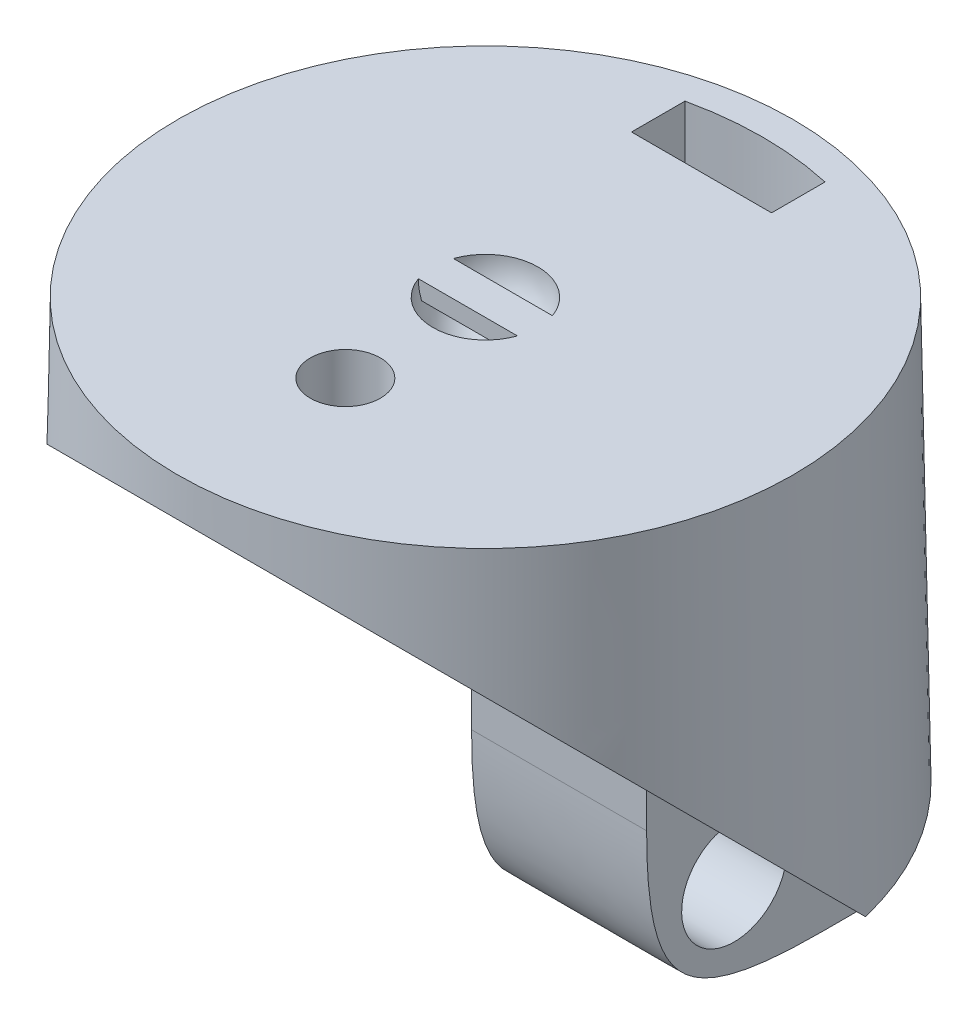
ISO-10303-21;
HEADER;
FILE_DESCRIPTION(('STEP AP214'),'2;1');
FILE_NAME('part.step','',(''),(''),'','','');
FILE_SCHEMA(('AUTOMOTIVE_DESIGN { 1 0 10303 214 1 1 1 1 }'));
ENDSEC;
DATA;
#1=APPLICATION_CONTEXT('core data for automotive mechanical design processes');
#2=APPLICATION_PROTOCOL_DEFINITION('international standard','automotive_design',2000,#1);
#3=PRODUCT_CONTEXT('',#1,'mechanical');
#4=PRODUCT('Part','Part','',(#3));
#5=PRODUCT_RELATED_PRODUCT_CATEGORY('part','',(#4));
#6=PRODUCT_DEFINITION_FORMATION('','',#4);
#7=PRODUCT_DEFINITION_CONTEXT('part definition',#1,'design');
#8=PRODUCT_DEFINITION('design','',#6,#7);
#9=PRODUCT_DEFINITION_SHAPE('','',#8);
#10=(LENGTH_UNIT() NAMED_UNIT(*) SI_UNIT(.MILLI.,.METRE.));
#11=(NAMED_UNIT(*) PLANE_ANGLE_UNIT() SI_UNIT($,.RADIAN.));
#12=(NAMED_UNIT(*) SI_UNIT($,.STERADIAN.) SOLID_ANGLE_UNIT());
#13=UNCERTAINTY_MEASURE_WITH_UNIT(LENGTH_MEASURE(1.E-05),#10,'distance_accuracy_value','');
#14=(GEOMETRIC_REPRESENTATION_CONTEXT(3) GLOBAL_UNCERTAINTY_ASSIGNED_CONTEXT((#13)) GLOBAL_UNIT_ASSIGNED_CONTEXT((#10,
#11,#12)) REPRESENTATION_CONTEXT('',''));
#15=CARTESIAN_POINT('',(0.,0.,0.));
#16=DIRECTION('',(0.,0.,1.));
#17=DIRECTION('',(1.,0.,0.));
#18=AXIS2_PLACEMENT_3D('',#15,#16,#17);
#19=CARTESIAN_POINT('',(0.,12.,0.));
#20=DIRECTION('',(-1.,0.,0.));
#21=DIRECTION('',(0.,0.,-1.));
#22=AXIS2_PLACEMENT_3D('',#19,#20,#21);
#23=SPHERICAL_SURFACE('',#22,1.5);
#24=CARTESIAN_POINT('',(0.,11.5,0.));
#25=DIRECTION('',(0.,1.,0.));
#26=DIRECTION('',(0.,0.,1.));
#27=AXIS2_PLACEMENT_3D('',#24,#25,#26);
#28=CIRCLE('',#27,1.4142135623731);
#29=CARTESIAN_POINT('',(1.3228756555323,11.5,0.500000000000002));
#30=VERTEX_POINT('',#29);
#31=CARTESIAN_POINT('',(1.3228756555323,11.5,-0.499999999999999));
#32=VERTEX_POINT('',#31);
#33=EDGE_CURVE('E72',#30,#32,#28,.T.);
#34=ORIENTED_EDGE('',*,*,#33,.T.);
#35=CARTESIAN_POINT('',(0.,12.,-0.499999999999998));
#36=DIRECTION('',(0.,0.,1.));
#37=DIRECTION('',(0.,-1.,0.));
#38=AXIS2_PLACEMENT_3D('',#35,#36,#37);
#39=CIRCLE('',#38,1.4142135623731);
#40=CARTESIAN_POINT('',(1.4142135623731,12.,-0.499999999999998));
#41=VERTEX_POINT('',#40);
#42=EDGE_CURVE('E14',#32,#41,#39,.T.);
#43=ORIENTED_EDGE('',*,*,#42,.T.);
#44=CARTESIAN_POINT('',(0.,12.,0.));
#45=DIRECTION('',(0.,-1.,0.));
#46=DIRECTION('',(0.,0.,-1.));
#47=AXIS2_PLACEMENT_3D('',#44,#45,#46);
#48=CIRCLE('',#47,1.5);
#49=CARTESIAN_POINT('',(-1.4142135623731,12.,-0.499999999999998));
#50=VERTEX_POINT('',#49);
#51=EDGE_CURVE('E168',#41,#50,#48,.F.);
#52=ORIENTED_EDGE('',*,*,#51,.T.);
#53=CARTESIAN_POINT('',(-1.3228756555323,11.5,-0.499999999999999));
#54=VERTEX_POINT('',#53);
#55=EDGE_CURVE('E61',#50,#54,#39,.T.);
#56=ORIENTED_EDGE('',*,*,#55,.T.);
#57=CARTESIAN_POINT('',(-1.3228756555323,11.5,0.500000000000002));
#58=VERTEX_POINT('',#57);
#59=EDGE_CURVE('E173',#54,#58,#28,.T.);
#60=ORIENTED_EDGE('',*,*,#59,.T.);
#61=CARTESIAN_POINT('',(0.,12.,0.500000000000002));
#62=DIRECTION('',(0.,0.,1.));
#63=DIRECTION('',(0.,-1.,0.));
#64=AXIS2_PLACEMENT_3D('',#61,#62,#63);
#65=CIRCLE('',#64,1.4142135623731);
#66=CARTESIAN_POINT('',(-1.4142135623731,12.,0.500000000000002));
#67=VERTEX_POINT('',#66);
#68=EDGE_CURVE('E171',#67,#58,#65,.T.);
#69=ORIENTED_EDGE('',*,*,#68,.F.);
#70=CARTESIAN_POINT('',(1.4142135623731,12.,0.500000000000002));
#71=VERTEX_POINT('',#70);
#72=EDGE_CURVE('E161',#67,#71,#48,.F.);
#73=ORIENTED_EDGE('',*,*,#72,.T.);
#74=EDGE_CURVE('E66',#30,#71,#65,.T.);
#75=ORIENTED_EDGE('',*,*,#74,.F.);
#76=EDGE_LOOP('',(#34,#43,#52,#56,#60,#69,#73,#75));
#77=FACE_BOUND('',#76,.T.);
#78=ADVANCED_FACE('F53',(#77),#23,.F.);
#79=CARTESIAN_POINT('',(0.,0.,0.));
#80=DIRECTION('',(0.,-1.,0.));
#81=DIRECTION('',(0.,0.,1.));
#82=AXIS2_PLACEMENT_3D('',#79,#80,#81);
#83=CONICAL_SURFACE('',#82,9.,0.0174532925199433);
#84=CARTESIAN_POINT('',(0.,12.,0.));
#85=DIRECTION('',(0.,-1.,0.));
#86=DIRECTION('',(0.,0.,-1.));
#87=AXIS2_PLACEMENT_3D('',#84,#85,#86);
#88=CIRCLE('',#87,8.79053922086139);
#89=CARTESIAN_POINT('',(0.,12.,-8.79053922086139));
#90=VERTEX_POINT('',#89);
#91=EDGE_CURVE('E430',#90,#90,#88,.F.);
#92=ORIENTED_EDGE('',*,*,#91,.F.);
#93=EDGE_LOOP('',(#92));
#94=FACE_BOUND('',#93,.T.);
#95=CARTESIAN_POINT('',(0.,-6.,0.));
#96=DIRECTION('',(0.,1.,0.));
#97=DIRECTION('',(0.,0.,1.));
#98=AXIS2_PLACEMENT_3D('',#95,#96,#97);
#99=CIRCLE('',#98,9.10473038956931);
#100=CARTESIAN_POINT('',(2.5,-6.,-8.75477672283804));
#101=VERTEX_POINT('',#100);
#102=CARTESIAN_POINT('',(-2.5,-6.,-8.75477672283804));
#103=VERTEX_POINT('',#102);
#104=EDGE_CURVE('E327',#101,#103,#99,.T.);
#105=ORIENTED_EDGE('',*,*,#104,.T.);
#106=CARTESIAN_POINT('',(-2.5,-20.7560434791036,-9.02234035392103));
#107=CARTESIAN_POINT('',(-2.5,-14.8260122266503,-8.91494203152043));
#108=CARTESIAN_POINT('',(-2.5,-8.89598374789002,-8.80739099326746));
#109=CARTESIAN_POINT('',(-2.5,2.96406766253684,-8.59198348505151));
#110=CARTESIAN_POINT('',(-2.5,8.89409059420336,-8.48412701508851));
#111=CARTESIAN_POINT('',(-2.5,14.8241107521769,-8.37611782927314));
#112=B_SPLINE_CURVE_WITH_KNOTS('',3,(#106,#107,#108,#109,#110,#111),.UNSPECIFIED.,.F.,.F.,(4,2,
4),(0.,17.7930111241083,35.5860222490931),.UNSPECIFIED.);
#113=CARTESIAN_POINT('',(-2.5,0.,-8.64580823289529));
#114=VERTEX_POINT('',#113);
#115=EDGE_CURVE('E255',#103,#114,#112,.T.);
#116=ORIENTED_EDGE('',*,*,#115,.T.);
#117=CARTESIAN_POINT('',(0.,0.,0.));
#118=DIRECTION('',(0.,1.,0.));
#119=DIRECTION('',(0.,0.,1.));
#120=AXIS2_PLACEMENT_3D('',#117,#118,#119);
#121=CIRCLE('',#120,9.);
#122=CARTESIAN_POINT('',(-8.75043484560759,0.,-2.10473038956931));
#123=VERTEX_POINT('',#122);
#124=EDGE_CURVE('E343',#123,#114,#121,.F.);
#125=ORIENTED_EDGE('',*,*,#124,.F.);
#126=CARTESIAN_POINT('',(0.,1.94822839006119,-0.156501999508105));
#127=DIRECTION('',(0.,0.707106781186549,-0.707106781186546));
#128=DIRECTION('',(0.,-0.707106781186546,-0.707106781186549));
#129=AXIS2_PLACEMENT_3D('',#126,#127,#128);
#130=ELLIPSE('',#129,12.6798296742555,8.96462756662068);
#131=CARTESIAN_POINT('',(8.75043484560758,0.,-2.10473038956931));
#132=VERTEX_POINT('',#131);
#133=EDGE_CURVE('E276',#132,#123,#130,.F.);
#134=ORIENTED_EDGE('',*,*,#133,.F.);
#135=CARTESIAN_POINT('',(0.,0.,0.));
#136=DIRECTION('',(0.,1.,0.));
#137=DIRECTION('',(0.,0.,1.));
#138=AXIS2_PLACEMENT_3D('',#135,#136,#137);
#139=CIRCLE('',#138,9.);
#140=CARTESIAN_POINT('',(2.5,0.,-8.64580823289529));
#141=VERTEX_POINT('',#140);
#142=EDGE_CURVE('E320',#141,#132,#139,.F.);
#143=ORIENTED_EDGE('',*,*,#142,.F.);
#144=CARTESIAN_POINT('',(2.50000000000001,-20.7560434791036,-9.02234035392103));
#145=CARTESIAN_POINT('',(2.5,-14.8260122266503,-8.91494203152043));
#146=CARTESIAN_POINT('',(2.5,-8.89598374789002,-8.80739099326746));
#147=CARTESIAN_POINT('',(2.5,2.96406766253684,-8.59198348505151));
#148=CARTESIAN_POINT('',(2.5,8.89409059420336,-8.48412701508851));
#149=CARTESIAN_POINT('',(2.5,14.8241107521769,-8.37611782927314));
#150=B_SPLINE_CURVE_WITH_KNOTS('',3,(#144,#145,#146,#147,#148,#149),.UNSPECIFIED.,.F.,.F.,(4,2,
4),(0.,17.7930111241083,35.5860222490931),.UNSPECIFIED.);
#151=EDGE_CURVE('E314',#101,#141,#150,.T.);
#152=ORIENTED_EDGE('',*,*,#151,.F.);
#153=EDGE_LOOP('',(#105,#116,#125,#134,#143,#152));
#154=FACE_BOUND('',#153,.T.);
#155=ADVANCED_FACE('F305',(#94,#154),#83,.T.);
#156=CARTESIAN_POINT('',(0.,-6.,0.));
#157=DIRECTION('',(0.,1.,0.));
#158=DIRECTION('',(0.,0.,1.));
#159=AXIS2_PLACEMENT_3D('',#156,#157,#158);
#160=PLANE('',#159);
#161=CARTESIAN_POINT('',(-2.75,-6.,-7.10473038956931));
#162=CARTESIAN_POINT('',(-0.916666666666667,-6.,-7.10473038956931));
#163=CARTESIAN_POINT('',(0.916666666666669,-6.,-7.10473038956931));
#164=CARTESIAN_POINT('',(2.75,-6.,-7.10473038956931));
#165=(BOUNDED_CURVE() B_SPLINE_CURVE(3,(#161,#162,#163,#164),.UNSPECIFIED.,.F.,
.F.) B_SPLINE_CURVE_WITH_KNOTS((4,4),(-0.00275,0.00275),
.UNSPECIFIED.) CURVE() GEOMETRIC_REPRESENTATION_ITEM() RATIONAL_B_SPLINE_CURVE((1.,1.,1.,1.)) REPRESENTATION_ITEM(''));
#166=CARTESIAN_POINT('',(2.5,-6.,-7.10473038956931));
#167=VERTEX_POINT('',#166);
#168=CARTESIAN_POINT('',(2.00000000000004,-6.,-7.10473038956931));
#169=VERTEX_POINT('',#168);
#170=EDGE_CURVE('E374',#167,#169,#165,.F.);
#171=ORIENTED_EDGE('',*,*,#170,.T.);
#172=DIRECTION('',(0.,0.,-1.));
#173=VECTOR('',#172,1.);
#174=CARTESIAN_POINT('',(2.00000000000003,-6.,0.));
#175=LINE('',#174,#173);
#176=CARTESIAN_POINT('',(2.00000000000004,-6.,-7.69942844932997));
#177=VERTEX_POINT('',#176);
#178=EDGE_CURVE('E455',#169,#177,#175,.T.);
#179=ORIENTED_EDGE('',*,*,#178,.T.);
#180=CARTESIAN_POINT('',(0.,-6.,1.23023823223999));
#181=DIRECTION('',(0.,1.,0.));
#182=DIRECTION('',(0.,0.,1.));
#183=AXIS2_PLACEMENT_3D('',#180,#181,#182);
#184=CIRCLE('',#183,9.15089870143587);
#185=CARTESIAN_POINT('',(-1.99999999999996,-6.,-7.69942844932997));
#186=VERTEX_POINT('',#185);
#187=EDGE_CURVE('E451',#177,#186,#184,.T.);
#188=ORIENTED_EDGE('',*,*,#187,.T.);
#189=DIRECTION('',(0.,0.,1.));
#190=VECTOR('',#189,1.);
#191=CARTESIAN_POINT('',(-1.99999999999996,-6.,0.));
#192=LINE('',#191,#190);
#193=CARTESIAN_POINT('',(-1.99999999999996,-6.,-7.10473038956931));
#194=VERTEX_POINT('',#193);
#195=EDGE_CURVE('E209',#186,#194,#192,.T.);
#196=ORIENTED_EDGE('',*,*,#195,.T.);
#197=CARTESIAN_POINT('',(-2.75,-6.,-7.10473038956931));
#198=CARTESIAN_POINT('',(-0.916666666666667,-6.,-7.10473038956931));
#199=CARTESIAN_POINT('',(0.916666666666669,-6.,-7.10473038956931));
#200=CARTESIAN_POINT('',(2.75,-6.,-7.10473038956931));
#201=(BOUNDED_CURVE() B_SPLINE_CURVE(3,(#197,#198,#199,#200),.UNSPECIFIED.,.F.,
.F.) B_SPLINE_CURVE_WITH_KNOTS((4,4),(-0.00275,0.00275),
.UNSPECIFIED.) CURVE() GEOMETRIC_REPRESENTATION_ITEM() RATIONAL_B_SPLINE_CURVE((1.,1.,1.,1.)) REPRESENTATION_ITEM(''));
#202=CARTESIAN_POINT('',(-2.5,-6.,-7.10473038956931));
#203=VERTEX_POINT('',#202);
#204=EDGE_CURVE('E287',#194,#203,#201,.F.);
#205=ORIENTED_EDGE('',*,*,#204,.T.);
#206=DIRECTION('',(0.,0.,1.));
#207=VECTOR('',#206,1.);
#208=CARTESIAN_POINT('',(-2.5,-6.,-9.10473038956931));
#209=LINE('',#208,#207);
#210=EDGE_CURVE('E346',#103,#203,#209,.T.);
#211=ORIENTED_EDGE('',*,*,#210,.F.);
#212=ORIENTED_EDGE('',*,*,#104,.F.);
#213=DIRECTION('',(0.,0.,1.));
#214=VECTOR('',#213,1.);
#215=CARTESIAN_POINT('',(2.5,-6.,-9.10473038956931));
#216=LINE('',#215,#214);
#217=EDGE_CURVE('E321',#101,#167,#216,.T.);
#218=ORIENTED_EDGE('',*,*,#217,.T.);
#219=EDGE_LOOP('',(#171,#179,#188,#196,#205,#211,#212,#218));
#220=FACE_BOUND('',#219,.T.);
#221=ADVANCED_FACE('F295',(#220),#160,.F.);
#222=CARTESIAN_POINT('',(-9.10473038956931,-6.,-2.10473038956931));
#223=DIRECTION('',(0.,0.,-1.));
#224=DIRECTION('',(0.,1.,0.));
#225=AXIS2_PLACEMENT_3D('',#222,#223,#224);
#226=PLANE('',#225);
#227=DIRECTION('',(0.,1.,0.));
#228=VECTOR('',#227,1.);
#229=CARTESIAN_POINT('',(-2.5,-6.,-2.10473038956931));
#230=LINE('',#229,#228);
#231=CARTESIAN_POINT('',(-2.5,-1.,-2.10473038956931));
#232=VERTEX_POINT('',#231);
#233=CARTESIAN_POINT('',(-2.5,0.,-2.10473038956931));
#234=VERTEX_POINT('',#233);
#235=EDGE_CURVE('E275',#232,#234,#230,.T.);
#236=ORIENTED_EDGE('',*,*,#235,.F.);
#237=CARTESIAN_POINT('',(2.75,-1.,-2.10473038956931));
#238=CARTESIAN_POINT('',(0.916666666666669,-1.,-2.10473038956931));
#239=CARTESIAN_POINT('',(-0.916666666666667,-1.,-2.10473038956931));
#240=CARTESIAN_POINT('',(-2.75,-1.,-2.10473038956931));
#241=(BOUNDED_CURVE() B_SPLINE_CURVE(3,(#237,#238,#239,#240),.UNSPECIFIED.,.F.,
.F.) B_SPLINE_CURVE_WITH_KNOTS((4,4),(-0.00275,0.00275),
.UNSPECIFIED.) CURVE() GEOMETRIC_REPRESENTATION_ITEM() RATIONAL_B_SPLINE_CURVE((1.,1.,1.,1.)) REPRESENTATION_ITEM(''));
#242=CARTESIAN_POINT('',(2.5,-1.,-2.10473038956931));
#243=VERTEX_POINT('',#242);
#244=EDGE_CURVE('E368',#232,#243,#241,.F.);
#245=ORIENTED_EDGE('',*,*,#244,.T.);
#246=DIRECTION('',(0.,1.,0.));
#247=VECTOR('',#246,1.);
#248=CARTESIAN_POINT('',(2.5,-6.,-2.10473038956931));
#249=LINE('',#248,#247);
#250=CARTESIAN_POINT('',(2.5,0.,-2.10473038956931));
#251=VERTEX_POINT('',#250);
#252=EDGE_CURVE('E267',#243,#251,#249,.T.);
#253=ORIENTED_EDGE('',*,*,#252,.T.);
#254=DIRECTION('',(1.,0.,0.));
#255=VECTOR('',#254,1.);
#256=CARTESIAN_POINT('',(-9.10473038956931,0.,-2.10473038956931));
#257=LINE('',#256,#255);
#258=EDGE_CURVE('E328',#234,#251,#257,.T.);
#259=ORIENTED_EDGE('',*,*,#258,.F.);
#260=EDGE_LOOP('',(#236,#245,#253,#259));
#261=FACE_BOUND('',#260,.T.);
#262=ADVANCED_FACE('F304',(#261),#226,.F.);
#263=CARTESIAN_POINT('',(-9.10473038956931,0.,-2.10473038956931));
#264=DIRECTION('',(0.,0.707106781186549,-0.707106781186546));
#265=DIRECTION('',(0.,0.707106781186546,0.707106781186549));
#266=AXIS2_PLACEMENT_3D('',#263,#264,#265);
#267=PLANE('',#266);
#268=CARTESIAN_POINT('',(0.,6.10473038956928,4.));
#269=DIRECTION('',(0.,0.707106781186549,-0.707106781186546));
#270=DIRECTION('',(0.,0.707106781186546,0.707106781186549));
#271=AXIS2_PLACEMENT_3D('',#268,#269,#270);
#272=ELLIPSE('',#271,1.41421356237309,1.);
#273=CARTESIAN_POINT('',(0.,7.10473038956928,5.));
#274=VERTEX_POINT('',#273);
#275=EDGE_CURVE('E431',#274,#274,#272,.T.);
#276=ORIENTED_EDGE('',*,*,#275,.T.);
#277=EDGE_LOOP('',(#276));
#278=FACE_BOUND('',#277,.T.);
#279=ORIENTED_EDGE('',*,*,#133,.T.);
#280=EDGE_CURVE('E325',#123,#234,#257,.T.);
#281=ORIENTED_EDGE('',*,*,#280,.T.);
#282=ORIENTED_EDGE('',*,*,#258,.T.);
#283=EDGE_CURVE('E324',#251,#132,#257,.T.);
#284=ORIENTED_EDGE('',*,*,#283,.T.);
#285=EDGE_LOOP('',(#279,#281,#282,#284));
#286=FACE_BOUND('',#285,.T.);
#287=ADVANCED_FACE('F338',(#278,#286),#267,.F.);
#288=CARTESIAN_POINT('',(2.5,0.,-9.10473038956931));
#289=DIRECTION('',(-1.,0.,0.));
#290=DIRECTION('',(0.,-1.,0.));
#291=AXIS2_PLACEMENT_3D('',#288,#289,#290);
#292=PLANE('',#291);
#293=CARTESIAN_POINT('',(2.5,-3.5,-4.6047303895693));
#294=DIRECTION('',(1.,0.,0.));
#295=DIRECTION('',(0.,1.,0.));
#296=AXIS2_PLACEMENT_3D('',#293,#294,#295);
#297=CIRCLE('',#296,1.5);
#298=CARTESIAN_POINT('',(2.5,-2.,-4.6047303895693));
#299=VERTEX_POINT('',#298);
#300=EDGE_CURVE('E353',#299,#299,#297,.T.);
#301=ORIENTED_EDGE('',*,*,#300,.F.);
#302=EDGE_LOOP('',(#301));
#303=FACE_BOUND('',#302,.T.);
#304=ORIENTED_EDGE('',*,*,#252,.F.);
#305=CARTESIAN_POINT('',(2.5,-6.,-7.10473038956931));
#306=CARTESIAN_POINT('',(2.5,-6.,-2.10473038956931));
#307=CARTESIAN_POINT('',(2.5,-1.,-2.10473038956931));
#308=(BOUNDED_CURVE() B_SPLINE_CURVE(2,(#305,#306,#307),.UNSPECIFIED.,.F.,
.F.) B_SPLINE_CURVE_WITH_KNOTS((3,3),(0.,1.),
.UNSPECIFIED.) CURVE() GEOMETRIC_REPRESENTATION_ITEM() RATIONAL_B_SPLINE_CURVE((1.,1.5,1.)) REPRESENTATION_ITEM(''));
#309=EDGE_CURVE('E372',#243,#167,#308,.F.);
#310=ORIENTED_EDGE('',*,*,#309,.T.);
#311=ORIENTED_EDGE('',*,*,#217,.F.);
#312=ORIENTED_EDGE('',*,*,#151,.T.);
#313=DIRECTION('',(0.,0.,1.));
#314=VECTOR('',#313,1.);
#315=CARTESIAN_POINT('',(2.5,0.,-9.10473038956931));
#316=LINE('',#315,#314);
#317=EDGE_CURVE('E322',#141,#251,#316,.T.);
#318=ORIENTED_EDGE('',*,*,#317,.T.);
#319=EDGE_LOOP('',(#304,#310,#311,#312,#318));
#320=FACE_BOUND('',#319,.T.);
#321=ADVANCED_FACE('F250',(#303,#320),#292,.F.);
#322=CARTESIAN_POINT('',(0.,0.,-9.10473038956931));
#323=DIRECTION('',(0.,1.,0.));
#324=DIRECTION('',(0.,0.,1.));
#325=AXIS2_PLACEMENT_3D('',#322,#323,#324);
#326=PLANE('',#325);
#327=ORIENTED_EDGE('',*,*,#142,.T.);
#328=ORIENTED_EDGE('',*,*,#283,.F.);
#329=ORIENTED_EDGE('',*,*,#317,.F.);
#330=EDGE_LOOP('',(#327,#328,#329));
#331=FACE_BOUND('',#330,.T.);
#332=ADVANCED_FACE('F248',(#331),#326,.F.);
#333=CARTESIAN_POINT('',(-2.5,0.,-9.10473038956931));
#334=DIRECTION('',(-1.,0.,0.));
#335=DIRECTION('',(0.,0.,1.));
#336=AXIS2_PLACEMENT_3D('',#333,#334,#335);
#337=PLANE('',#336);
#338=CARTESIAN_POINT('',(-2.5,-3.5,-4.6047303895693));
#339=DIRECTION('',(-1.,0.,0.));
#340=DIRECTION('',(0.,0.,1.));
#341=AXIS2_PLACEMENT_3D('',#338,#339,#340);
#342=CIRCLE('',#341,1.5);
#343=CARTESIAN_POINT('',(-2.5,-3.5,-3.10473038956931));
#344=VERTEX_POINT('',#343);
#345=EDGE_CURVE('E284',#344,#344,#342,.T.);
#346=ORIENTED_EDGE('',*,*,#345,.F.);
#347=EDGE_LOOP('',(#346));
#348=FACE_BOUND('',#347,.T.);
#349=ORIENTED_EDGE('',*,*,#210,.T.);
#350=CARTESIAN_POINT('',(-2.5,-1.,-2.10473038956931));
#351=CARTESIAN_POINT('',(-2.5,-6.,-2.10473038956931));
#352=CARTESIAN_POINT('',(-2.5,-6.,-7.10473038956931));
#353=(BOUNDED_CURVE() B_SPLINE_CURVE(2,(#350,#351,#352),.UNSPECIFIED.,.F.,
.F.) B_SPLINE_CURVE_WITH_KNOTS((3,3),(0.,1.),
.UNSPECIFIED.) CURVE() GEOMETRIC_REPRESENTATION_ITEM() RATIONAL_B_SPLINE_CURVE((1.,1.5,1.)) REPRESENTATION_ITEM(''));
#354=EDGE_CURVE('E373',#203,#232,#353,.F.);
#355=ORIENTED_EDGE('',*,*,#354,.T.);
#356=ORIENTED_EDGE('',*,*,#235,.T.);
#357=DIRECTION('',(0.,0.,1.));
#358=VECTOR('',#357,1.);
#359=CARTESIAN_POINT('',(-2.5,0.,-9.10473038956931));
#360=LINE('',#359,#358);
#361=EDGE_CURVE('E348',#114,#234,#360,.T.);
#362=ORIENTED_EDGE('',*,*,#361,.F.);
#363=ORIENTED_EDGE('',*,*,#115,.F.);
#364=EDGE_LOOP('',(#349,#355,#356,#362,#363));
#365=FACE_BOUND('',#364,.T.);
#366=ADVANCED_FACE('F243',(#348,#365),#337,.T.);
#367=CARTESIAN_POINT('',(0.,0.,-9.10473038956931));
#368=DIRECTION('',(0.,1.,0.));
#369=DIRECTION('',(0.,0.,1.));
#370=AXIS2_PLACEMENT_3D('',#367,#368,#369);
#371=PLANE('',#370);
#372=ORIENTED_EDGE('',*,*,#124,.T.);
#373=ORIENTED_EDGE('',*,*,#361,.T.);
#374=ORIENTED_EDGE('',*,*,#280,.F.);
#375=EDGE_LOOP('',(#372,#373,#374));
#376=FACE_BOUND('',#375,.T.);
#377=ADVANCED_FACE('F239',(#376),#371,.F.);
#378=CARTESIAN_POINT('',(-8.96462756662068,-3.5,-4.6047303895693));
#379=DIRECTION('',(1.,0.,0.));
#380=DIRECTION('',(0.,1.,0.));
#381=AXIS2_PLACEMENT_3D('',#378,#379,#380);
#382=CYLINDRICAL_SURFACE('',#381,1.5);
#383=ORIENTED_EDGE('',*,*,#345,.T.);
#384=EDGE_LOOP('',(#383));
#385=FACE_BOUND('',#384,.T.);
#386=ORIENTED_EDGE('',*,*,#300,.T.);
#387=EDGE_LOOP('',(#386));
#388=FACE_BOUND('',#387,.T.);
#389=ADVANCED_FACE('F236',(#385,#388),#382,.F.);
#390=CARTESIAN_POINT('',(2.75,-6.,-7.10473038956931));
#391=CARTESIAN_POINT('',(0.916666666666669,-6.,-7.10473038956931));
#392=CARTESIAN_POINT('',(-0.916666666666667,-6.,-7.10473038956931));
#393=CARTESIAN_POINT('',(-2.75,-6.,-7.10473038956931));
#394=CARTESIAN_POINT('',(2.75,-6.,-2.10473038956931));
#395=CARTESIAN_POINT('',(0.916666666666667,-6.,-2.10473038956931));
#396=CARTESIAN_POINT('',(-0.916666666666665,-6.,-2.10473038956931));
#397=CARTESIAN_POINT('',(-2.75,-6.,-2.10473038956931));
#398=CARTESIAN_POINT('',(2.75,-1.,-2.10473038956931));
#399=CARTESIAN_POINT('',(0.916666666666669,-1.,-2.10473038956931));
#400=CARTESIAN_POINT('',(-0.916666666666667,-1.,-2.10473038956931));
#401=CARTESIAN_POINT('',(-2.75,-1.,-2.10473038956931));
#402=(BOUNDED_SURFACE() B_SPLINE_SURFACE(2,3,((#390,#391,#392,#393),(#394,#395,#396,#397),(#398,
#399,#400,#401)),.UNSPECIFIED.,.F.,.F.,.F.) B_SPLINE_SURFACE_WITH_KNOTS((3,3),(4,4),(0.,1.),
(-0.00275,0.00275),
.UNSPECIFIED.) GEOMETRIC_REPRESENTATION_ITEM() RATIONAL_B_SPLINE_SURFACE(((1.,1.,1.,1.),(1.5,
1.5,1.5,1.5),(1.,1.,1.,1.))) REPRESENTATION_ITEM('') SURFACE());
#403=CARTESIAN_POINT('',(2.00000000000004,-6.,-7.10473038956931));
#404=CARTESIAN_POINT('',(2.00000000000004,-5.99999950150621,-7.05289473818634));
#405=CARTESIAN_POINT('',(2.00000000000004,-5.99982084456647,-7.00105885413805));
#406=CARTESIAN_POINT('',(2.00000000000004,-5.99907779103353,-6.89739730217112));
#407=CARTESIAN_POINT('',(2.00000000000003,-5.99851344961799,-6.84557163385173));
#408=CARTESIAN_POINT('',(2.00000000000003,-5.99696968537205,-6.74193068038256));
#409=CARTESIAN_POINT('',(2.00000000000003,-5.99599029711521,-6.69011539472751));
#410=CARTESIAN_POINT('',(2.00000000000003,-5.9935829707002,-6.58649434364744));
#411=CARTESIAN_POINT('',(2.00000000000003,-5.99215502541916,-6.53468857838667));
#412=CARTESIAN_POINT('',(2.00000000000003,-5.98881397716295,-6.43108901420178));
#413=CARTESIAN_POINT('',(2.00000000000003,-5.98690084148191,-6.37929521632002));
#414=CARTESIAN_POINT('',(2.00000000000003,-5.9825472884145,-6.27572139954842));
#415=CARTESIAN_POINT('',(2.00000000000003,-5.98010678512912,-6.22394138428084));
#416=CARTESIAN_POINT('',(2.00000000000004,-5.97738181404722,-6.1721758636608));
#417=B_SPLINE_CURVE_WITH_KNOTS('',3,(#403,#404,#405,#406,#407,#408,#409,#410,#411,#412,#413,
#414,#415,#416),.UNSPECIFIED.,.F.,.F.,(4,2,2,2,2,2,4),(0.,0.155506993605239,0.310991744379603,
0.466463545754057,0.621937816069836,0.777422569435212,0.932932667677538),.UNSPECIFIED.);
#418=CARTESIAN_POINT('',(2.00000000000003,-5.97738181404722,-6.1721758636608));
#419=VERTEX_POINT('',#418);
#420=EDGE_CURVE('E459',#169,#419,#417,.T.);
#421=CARTESIAN_POINT('',(-1.99999999999996,-5.97738181404722,-6.1721758636608));
#422=CARTESIAN_POINT('',(-1.99999999999996,-5.98010678512912,-6.22394138428084));
#423=CARTESIAN_POINT('',(-1.99999999999996,-5.9825472884145,-6.27572139954842));
#424=CARTESIAN_POINT('',(-1.99999999999996,-5.98690084148191,-6.37929521632002));
#425=CARTESIAN_POINT('',(-1.99999999999996,-5.98881397716295,-6.43108901420178));
#426=CARTESIAN_POINT('',(-1.99999999999996,-5.99215502541916,-6.53468857838667));
#427=CARTESIAN_POINT('',(-1.99999999999996,-5.9935829707002,-6.58649434364744));
#428=CARTESIAN_POINT('',(-1.99999999999996,-5.99599029711521,-6.69011539472751));
#429=CARTESIAN_POINT('',(-1.99999999999996,-5.99696968537205,-6.74193068038256));
#430=CARTESIAN_POINT('',(-1.99999999999996,-5.99851344961799,-6.84557163385173));
#431=CARTESIAN_POINT('',(-1.99999999999996,-5.99907779103353,-6.89739730217113));
#432=CARTESIAN_POINT('',(-1.99999999999996,-5.99982084456647,-7.00105885413805));
#433=CARTESIAN_POINT('',(-1.99999999999996,-5.99999950150621,-7.05289473818634));
#434=CARTESIAN_POINT('',(-1.99999999999996,-6.,-7.10473038956931));
#435=B_SPLINE_CURVE_WITH_KNOTS('',3,(#421,#422,#423,#424,#425,#426,#427,#428,#429,#430,#431,
#432,#433,#434),.UNSPECIFIED.,.F.,.F.,(4,2,2,2,2,2,4),(0.,0.155510098242327,0.310994851607703,
0.466469121923482,0.621940923297935,0.7774256740723,0.932932667677538),.UNSPECIFIED.);
#436=CARTESIAN_POINT('',(-1.99999999999996,-5.97738181404722,-6.1721758636608));
#437=VERTEX_POINT('',#436);
#438=EDGE_CURVE('E201',#437,#194,#435,.T.);
#439=DIRECTION('',(-1.,0.,0.));
#440=VECTOR('',#439,1.);
#441=CARTESIAN_POINT('',(0.,-5.97738181404722,-6.1721758636608));
#442=LINE('',#441,#440);
#443=EDGE_CURVE('E619',#419,#437,#442,.T.);
#444=ORIENTED_EDGE('',*,*,#420,.F.);
#445=ORIENTED_EDGE('',*,*,#170,.F.);
#446=ORIENTED_EDGE('',*,*,#309,.F.);
#447=ORIENTED_EDGE('',*,*,#244,.F.);
#448=ORIENTED_EDGE('',*,*,#354,.F.);
#449=ORIENTED_EDGE('',*,*,#204,.F.);
#450=ORIENTED_EDGE('',*,*,#438,.F.);
#451=ORIENTED_EDGE('',*,*,#443,.F.);
#452=EDGE_LOOP('',(#444,#445,#446,#447,#448,#449,#450,#451));
#453=FACE_BOUND('',#452,.T.);
#454=ADVANCED_FACE('F56',(#453),#402,.T.);
#455=CARTESIAN_POINT('',(-8.96462756662068,12.,-11.2505039455349));
#456=DIRECTION('',(0.,-1.,0.));
#457=DIRECTION('',(0.,0.,-1.));
#458=AXIS2_PLACEMENT_3D('',#455,#456,#457);
#459=PLANE('',#458);
#460=DIRECTION('',(1.,0.,0.));
#461=VECTOR('',#460,1.);
#462=CARTESIAN_POINT('',(0.,12.,0.500000000000002));
#463=LINE('',#462,#461);
#464=EDGE_CURVE('E166',#67,#71,#463,.T.);
#465=ORIENTED_EDGE('',*,*,#464,.T.);
#466=ORIENTED_EDGE('',*,*,#72,.F.);
#467=EDGE_LOOP('',(#465,#466));
#468=FACE_BOUND('',#467,.T.);
#469=ORIENTED_EDGE('',*,*,#51,.F.);
#470=DIRECTION('',(1.,0.,0.));
#471=VECTOR('',#470,1.);
#472=CARTESIAN_POINT('',(0.,12.,-0.499999999999998));
#473=LINE('',#472,#471);
#474=EDGE_CURVE('E179',#50,#41,#473,.T.);
#475=ORIENTED_EDGE('',*,*,#474,.F.);
#476=EDGE_LOOP('',(#469,#475));
#477=FACE_BOUND('',#476,.T.);
#478=DIRECTION('',(0.,0.,1.));
#479=VECTOR('',#478,1.);
#480=CARTESIAN_POINT('',(-1.99999999999996,12.,-7.69942844932997));
#481=LINE('',#480,#479);
#482=CARTESIAN_POINT('',(-1.99999999999996,12.,-7.69942844932997));
#483=VERTEX_POINT('',#482);
#484=CARTESIAN_POINT('',(-1.99999999999996,12.,-6.1721758636608));
#485=VERTEX_POINT('',#484);
#486=EDGE_CURVE('E189',#483,#485,#481,.T.);
#487=ORIENTED_EDGE('',*,*,#486,.F.);
#488=CARTESIAN_POINT('',(0.,12.,1.23023823224));
#489=DIRECTION('',(0.,1.,0.));
#490=DIRECTION('',(0.,0.,1.));
#491=AXIS2_PLACEMENT_3D('',#488,#489,#490);
#492=CIRCLE('',#491,9.15089870143587);
#493=CARTESIAN_POINT('',(2.00000000000004,12.,-7.69942844932996));
#494=VERTEX_POINT('',#493);
#495=EDGE_CURVE('E167',#494,#483,#492,.T.);
#496=ORIENTED_EDGE('',*,*,#495,.F.);
#497=DIRECTION('',(0.,0.,-1.));
#498=VECTOR('',#497,1.);
#499=CARTESIAN_POINT('',(2.00000000000003,12.,-6.1721758636608));
#500=LINE('',#499,#498);
#501=CARTESIAN_POINT('',(2.00000000000003,12.,-6.1721758636608));
#502=VERTEX_POINT('',#501);
#503=EDGE_CURVE('E195',#502,#494,#500,.T.);
#504=ORIENTED_EDGE('',*,*,#503,.F.);
#505=DIRECTION('',(1.,0.,0.));
#506=VECTOR('',#505,1.);
#507=CARTESIAN_POINT('',(-1.99999999999996,12.,-6.1721758636608));
#508=LINE('',#507,#506);
#509=EDGE_CURVE('E192',#485,#502,#508,.T.);
#510=ORIENTED_EDGE('',*,*,#509,.F.);
#511=EDGE_LOOP('',(#487,#496,#504,#510));
#512=FACE_BOUND('',#511,.T.);
#513=CARTESIAN_POINT('',(0.,12.,4.));
#514=DIRECTION('',(0.,1.,0.));
#515=DIRECTION('',(0.,0.,1.));
#516=AXIS2_PLACEMENT_3D('',#513,#514,#515);
#517=CIRCLE('',#516,1.);
#518=CARTESIAN_POINT('',(0.,12.,5.));
#519=VERTEX_POINT('',#518);
#520=EDGE_CURVE('E427',#519,#519,#517,.T.);
#521=ORIENTED_EDGE('',*,*,#520,.F.);
#522=EDGE_LOOP('',(#521));
#523=FACE_BOUND('',#522,.T.);
#524=ORIENTED_EDGE('',*,*,#91,.T.);
#525=EDGE_LOOP('',(#524));
#526=FACE_BOUND('',#525,.T.);
#527=ADVANCED_FACE('F163',(#468,#477,#512,#523,#526),#459,.F.);
#528=CARTESIAN_POINT('',(0.,-6.025,4.));
#529=DIRECTION('',(0.,1.,0.));
#530=DIRECTION('',(0.,0.,1.));
#531=AXIS2_PLACEMENT_3D('',#528,#529,#530);
#532=CYLINDRICAL_SURFACE('',#531,1.);
#533=ORIENTED_EDGE('',*,*,#520,.T.);
#534=EDGE_LOOP('',(#533));
#535=FACE_BOUND('',#534,.T.);
#536=ORIENTED_EDGE('',*,*,#275,.F.);
#537=EDGE_LOOP('',(#536));
#538=FACE_BOUND('',#537,.T.);
#539=ADVANCED_FACE('F229',(#535,#538),#532,.F.);
#540=CARTESIAN_POINT('',(0.,-6.025,1.23023823223999));
#541=DIRECTION('',(0.,1.,0.));
#542=DIRECTION('',(0.,0.,1.));
#543=AXIS2_PLACEMENT_3D('',#540,#541,#542);
#544=CYLINDRICAL_SURFACE('',#543,9.15089870143587);
#545=DIRECTION('',(0.,1.,0.));
#546=VECTOR('',#545,1.);
#547=CARTESIAN_POINT('',(2.00000000000004,-6.025,-7.69942844932997));
#548=LINE('',#547,#546);
#549=EDGE_CURVE('E199',#177,#494,#548,.T.);
#550=ORIENTED_EDGE('',*,*,#549,.T.);
#551=ORIENTED_EDGE('',*,*,#495,.T.);
#552=DIRECTION('',(0.,1.,0.));
#553=VECTOR('',#552,1.);
#554=CARTESIAN_POINT('',(-1.99999999999996,-6.025,-7.69942844932997));
#555=LINE('',#554,#553);
#556=EDGE_CURVE('E198',#186,#483,#555,.T.);
#557=ORIENTED_EDGE('',*,*,#556,.F.);
#558=ORIENTED_EDGE('',*,*,#187,.F.);
#559=EDGE_LOOP('',(#550,#551,#557,#558));
#560=FACE_BOUND('',#559,.T.);
#561=ADVANCED_FACE('F226',(#560),#544,.F.);
#562=CARTESIAN_POINT('',(2.00000000000003,-6.025,-6.1721758636608));
#563=DIRECTION('',(1.,0.,0.));
#564=DIRECTION('',(0.,0.,-1.));
#565=AXIS2_PLACEMENT_3D('',#562,#563,#564);
#566=PLANE('',#565);
#567=ORIENTED_EDGE('',*,*,#420,.T.);
#568=DIRECTION('',(0.,1.,0.));
#569=VECTOR('',#568,1.);
#570=CARTESIAN_POINT('',(2.00000000000003,-6.025,-6.1721758636608));
#571=LINE('',#570,#569);
#572=EDGE_CURVE('E202',#419,#502,#571,.T.);
#573=ORIENTED_EDGE('',*,*,#572,.T.);
#574=ORIENTED_EDGE('',*,*,#503,.T.);
#575=ORIENTED_EDGE('',*,*,#549,.F.);
#576=ORIENTED_EDGE('',*,*,#178,.F.);
#577=EDGE_LOOP('',(#567,#573,#574,#575,#576));
#578=FACE_BOUND('',#577,.T.);
#579=ADVANCED_FACE('F223',(#578),#566,.F.);
#580=CARTESIAN_POINT('',(-1.99999999999996,-6.025,-7.69942844932997));
#581=DIRECTION('',(-1.,0.,0.));
#582=DIRECTION('',(0.,0.,1.));
#583=AXIS2_PLACEMENT_3D('',#580,#581,#582);
#584=PLANE('',#583);
#585=ORIENTED_EDGE('',*,*,#556,.T.);
#586=ORIENTED_EDGE('',*,*,#486,.T.);
#587=DIRECTION('',(0.,1.,0.));
#588=VECTOR('',#587,1.);
#589=CARTESIAN_POINT('',(-1.99999999999996,-6.025,-6.1721758636608));
#590=LINE('',#589,#588);
#591=EDGE_CURVE('E204',#437,#485,#590,.T.);
#592=ORIENTED_EDGE('',*,*,#591,.F.);
#593=ORIENTED_EDGE('',*,*,#438,.T.);
#594=ORIENTED_EDGE('',*,*,#195,.F.);
#595=EDGE_LOOP('',(#585,#586,#592,#593,#594));
#596=FACE_BOUND('',#595,.T.);
#597=ADVANCED_FACE('F217',(#596),#584,.F.);
#598=CARTESIAN_POINT('',(-1.99999999999996,-6.025,-6.1721758636608));
#599=DIRECTION('',(0.,0.,1.));
#600=DIRECTION('',(0.,-1.,0.));
#601=AXIS2_PLACEMENT_3D('',#598,#599,#600);
#602=PLANE('',#601);
#603=ORIENTED_EDGE('',*,*,#443,.T.);
#604=ORIENTED_EDGE('',*,*,#591,.T.);
#605=ORIENTED_EDGE('',*,*,#509,.T.);
#606=ORIENTED_EDGE('',*,*,#572,.F.);
#607=EDGE_LOOP('',(#603,#604,#605,#606));
#608=FACE_BOUND('',#607,.T.);
#609=ADVANCED_FACE('F222',(#608),#602,.F.);
#610=CARTESIAN_POINT('',(0.,11.5,-0.499999999999999));
#611=DIRECTION('',(0.,0.,1.));
#612=DIRECTION('',(0.,-1.,0.));
#613=AXIS2_PLACEMENT_3D('',#610,#611,#612);
#614=PLANE('',#613);
#615=ORIENTED_EDGE('',*,*,#42,.F.);
#616=DIRECTION('',(1.,0.,0.));
#617=VECTOR('',#616,1.);
#618=CARTESIAN_POINT('',(0.,11.5,-0.499999999999999));
#619=LINE('',#618,#617);
#620=EDGE_CURVE('E178',#54,#32,#619,.T.);
#621=ORIENTED_EDGE('',*,*,#620,.F.);
#622=ORIENTED_EDGE('',*,*,#55,.F.);
#623=ORIENTED_EDGE('',*,*,#474,.T.);
#624=EDGE_LOOP('',(#615,#621,#622,#623));
#625=FACE_BOUND('',#624,.T.);
#626=ADVANCED_FACE('F418',(#625),#614,.F.);
#627=CARTESIAN_POINT('',(0.,11.5,0.500000000000002));
#628=DIRECTION('',(0.,0.,1.));
#629=DIRECTION('',(0.,-1.,0.));
#630=AXIS2_PLACEMENT_3D('',#627,#628,#629);
#631=PLANE('',#630);
#632=DIRECTION('',(1.,0.,0.));
#633=VECTOR('',#632,1.);
#634=CARTESIAN_POINT('',(0.,11.5,0.500000000000002));
#635=LINE('',#634,#633);
#636=EDGE_CURVE('E182',#58,#30,#635,.T.);
#637=ORIENTED_EDGE('',*,*,#636,.T.);
#638=ORIENTED_EDGE('',*,*,#74,.T.);
#639=ORIENTED_EDGE('',*,*,#464,.F.);
#640=ORIENTED_EDGE('',*,*,#68,.T.);
#641=EDGE_LOOP('',(#637,#638,#639,#640));
#642=FACE_BOUND('',#641,.T.);
#643=ADVANCED_FACE('F177',(#642),#631,.T.);
#644=CARTESIAN_POINT('',(0.,11.5,0.));
#645=DIRECTION('',(0.,1.,0.));
#646=DIRECTION('',(0.,0.,1.));
#647=AXIS2_PLACEMENT_3D('',#644,#645,#646);
#648=PLANE('',#647);
#649=ORIENTED_EDGE('',*,*,#33,.F.);
#650=ORIENTED_EDGE('',*,*,#636,.F.);
#651=ORIENTED_EDGE('',*,*,#59,.F.);
#652=ORIENTED_EDGE('',*,*,#620,.T.);
#653=EDGE_LOOP('',(#649,#650,#651,#652));
#654=FACE_BOUND('',#653,.T.);
#655=ADVANCED_FACE('F417',(#654),#648,.F.);
#656=CLOSED_SHELL('',(#78,#155,#221,#262,#287,#321,#332,#366,#377,#389,#454,#527,#539,#561,#579,
#597,#609,#626,#643,#655));
#657=MANIFOLD_SOLID_BREP('B2',#656);
#658=ADVANCED_BREP_SHAPE_REPRESENTATION('',(#18,#657),#14);
#659=SHAPE_DEFINITION_REPRESENTATION(#9,#658);
ENDSEC;
END-ISO-10303-21;
